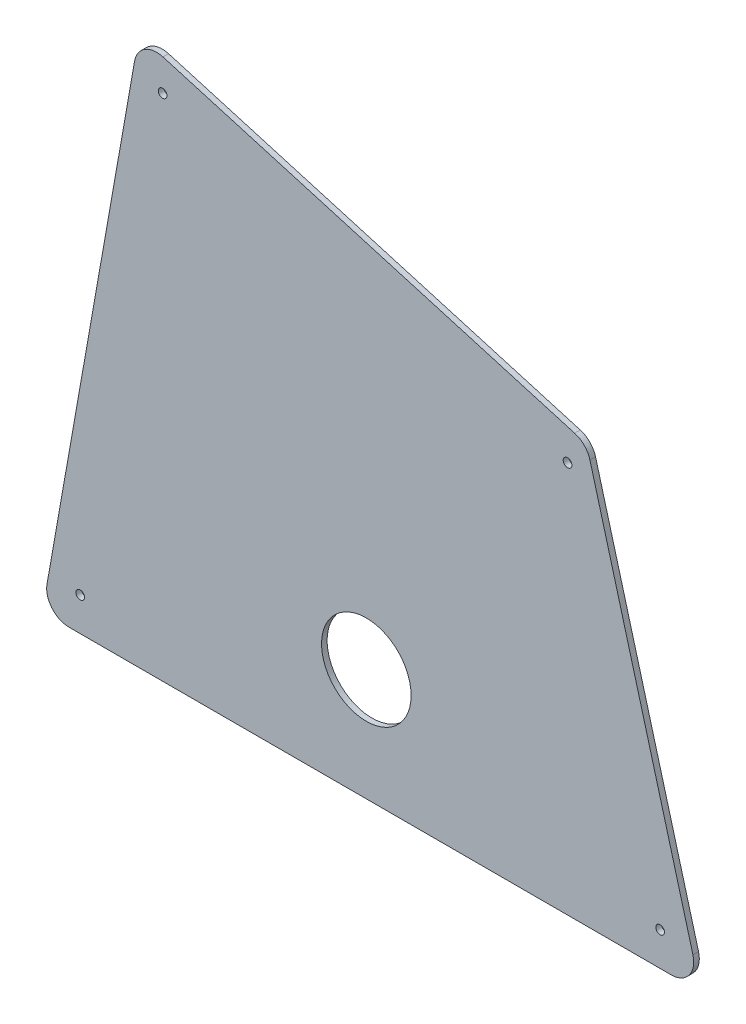
ISO-10303-21;
HEADER;
FILE_DESCRIPTION(('STEP AP214'),'2;1');
FILE_NAME('part.step','',(''),(''),'','','');
FILE_SCHEMA(('AUTOMOTIVE_DESIGN { 1 0 10303 214 1 1 1 1 }'));
ENDSEC;
DATA;
#1=APPLICATION_CONTEXT('core data for automotive mechanical design processes');
#2=APPLICATION_PROTOCOL_DEFINITION('international standard','automotive_design',2000,#1);
#3=PRODUCT_CONTEXT('',#1,'mechanical');
#4=PRODUCT('Part','Part','',(#3));
#5=PRODUCT_RELATED_PRODUCT_CATEGORY('part','',(#4));
#6=PRODUCT_DEFINITION_FORMATION('','',#4);
#7=PRODUCT_DEFINITION_CONTEXT('part definition',#1,'design');
#8=PRODUCT_DEFINITION('design','',#6,#7);
#9=PRODUCT_DEFINITION_SHAPE('','',#8);
#10=(LENGTH_UNIT() NAMED_UNIT(*) SI_UNIT(.MILLI.,.METRE.));
#11=(NAMED_UNIT(*) PLANE_ANGLE_UNIT() SI_UNIT($,.RADIAN.));
#12=(NAMED_UNIT(*) SI_UNIT($,.STERADIAN.) SOLID_ANGLE_UNIT());
#13=UNCERTAINTY_MEASURE_WITH_UNIT(LENGTH_MEASURE(1.E-05),#10,'distance_accuracy_value','');
#14=(GEOMETRIC_REPRESENTATION_CONTEXT(3) GLOBAL_UNCERTAINTY_ASSIGNED_CONTEXT((#13)) GLOBAL_UNIT_ASSIGNED_CONTEXT((#10,
#11,#12)) REPRESENTATION_CONTEXT('',''));
#15=CARTESIAN_POINT('',(0.,0.,0.));
#16=DIRECTION('',(0.,0.,1.));
#17=DIRECTION('',(1.,0.,0.));
#18=AXIS2_PLACEMENT_3D('',#15,#16,#17);
#19=CARTESIAN_POINT('',(-168.674542419112,-172.318008497211,3.175));
#20=DIRECTION('',(0.,0.,-1.));
#21=DIRECTION('',(-1.,0.,0.));
#22=AXIS2_PLACEMENT_3D('',#19,#20,#21);
#23=PLANE('',#22);
#24=CARTESIAN_POINT('',(-115.585524201329,103.906991502789,3.175));
#25=DIRECTION('',(0.,0.,1.));
#26=DIRECTION('',(1.,0.,0.));
#27=AXIS2_PLACEMENT_3D('',#24,#25,#26);
#28=CIRCLE('',#27,2.45744999999999);
#29=CARTESIAN_POINT('',(-113.128074201329,103.906991502789,3.175));
#30=VERTEX_POINT('',#29);
#31=EDGE_CURVE('E206',#30,#30,#28,.T.);
#32=ORIENTED_EDGE('',*,*,#31,.F.);
#33=EDGE_LOOP('',(#32));
#34=FACE_BOUND('',#33,.T.);
#35=CARTESIAN_POINT('',(114.17272654423,37.2319915027894,3.175));
#36=DIRECTION('',(0.,0.,1.));
#37=DIRECTION('',(1.,0.,0.));
#38=AXIS2_PLACEMENT_3D('',#35,#36,#37);
#39=CIRCLE('',#38,2.45744999999999);
#40=CARTESIAN_POINT('',(116.63017654423,37.2319915027894,3.175));
#41=VERTEX_POINT('',#40);
#42=EDGE_CURVE('E200',#41,#41,#39,.T.);
#43=ORIENTED_EDGE('',*,*,#42,.F.);
#44=EDGE_LOOP('',(#43));
#45=FACE_BOUND('',#44,.T.);
#46=CARTESIAN_POINT('',(166.708204177403,-165.968008497211,3.175));
#47=DIRECTION('',(0.,0.,1.));
#48=DIRECTION('',(1.,0.,0.));
#49=AXIS2_PLACEMENT_3D('',#46,#47,#48);
#50=CIRCLE('',#49,2.45745);
#51=CARTESIAN_POINT('',(169.165654177403,-165.968008497211,3.175));
#52=VERTEX_POINT('',#51);
#53=EDGE_CURVE('E194',#52,#52,#50,.T.);
#54=ORIENTED_EDGE('',*,*,#53,.F.);
#55=EDGE_LOOP('',(#54));
#56=FACE_BOUND('',#55,.T.);
#57=CARTESIAN_POINT('',(-162.324542419112,-165.968008497211,3.175));
#58=DIRECTION('',(0.,0.,1.));
#59=DIRECTION('',(1.,0.,0.));
#60=AXIS2_PLACEMENT_3D('',#57,#58,#59);
#61=CIRCLE('',#60,2.45745);
#62=CARTESIAN_POINT('',(-159.867092419112,-165.968008497211,3.175));
#63=VERTEX_POINT('',#62);
#64=EDGE_CURVE('E188',#63,#63,#61,.T.);
#65=ORIENTED_EDGE('',*,*,#64,.F.);
#66=EDGE_LOOP('',(#65));
#67=FACE_BOUND('',#66,.T.);
#68=CARTESIAN_POINT('',(-168.674542419112,-172.318008497211,3.175));
#69=DIRECTION('',(0.,0.,1.));
#70=DIRECTION('',(-1.,0.,0.));
#71=AXIS2_PLACEMENT_3D('',#68,#69,#70);
#72=CIRCLE('',#71,12.7);
#73=CARTESIAN_POINT('',(-181.181600882367,-170.112676640841,3.175));
#74=VERTEX_POINT('',#73);
#75=CARTESIAN_POINT('',(-168.674542419112,-185.018008497211,3.175));
#76=VERTEX_POINT('',#75);
#77=EDGE_CURVE('E146',#74,#76,#72,.T.);
#78=ORIENTED_EDGE('',*,*,#77,.T.);
#79=DIRECTION('',(1.,0.,0.));
#80=VECTOR('',#79,1.);
#81=CARTESIAN_POINT('',(-168.674542419112,-185.018008497211,3.175));
#82=LINE('',#81,#80);
#83=CARTESIAN_POINT('',(173.058204177403,-185.018008497211,3.175));
#84=VERTEX_POINT('',#83);
#85=EDGE_CURVE('E94',#76,#84,#82,.T.);
#86=ORIENTED_EDGE('',*,*,#85,.T.);
#87=CARTESIAN_POINT('',(173.058204177403,-172.318008497211,3.175));
#88=DIRECTION('',(0.,0.,1.));
#89=DIRECTION('',(1.,0.,0.));
#90=AXIS2_PLACEMENT_3D('',#87,#88,#89);
#91=CIRCLE('',#90,12.7);
#92=CARTESIAN_POINT('',(185.309252430684,-168.971096981235,3.175));
#93=VERTEX_POINT('',#92);
#94=EDGE_CURVE('E161',#84,#93,#91,.T.);
#95=ORIENTED_EDGE('',*,*,#94,.T.);
#96=DIRECTION('',(-0.263536339840617,0.964649468762312,0.));
#97=VECTOR('',#96,1.);
#98=CARTESIAN_POINT('',(185.309252430684,-168.971096981235,3.175));
#99=LINE('',#98,#97);
#100=CARTESIAN_POINT('',(126.87272654423,44.930195291305,3.175));
#101=VERTEX_POINT('',#100);
#102=EDGE_CURVE('E174',#93,#101,#99,.T.);
#103=ORIENTED_EDGE('',*,*,#102,.T.);
#104=CARTESIAN_POINT('',(114.621678290948,41.5832837753292,3.175));
#105=DIRECTION('',(0.,0.,1.));
#106=DIRECTION('',(-1.,0.,0.));
#107=AXIS2_PLACEMENT_3D('',#104,#105,#106);
#108=CIRCLE('',#107,12.7);
#109=CARTESIAN_POINT('',(118.175506769142,53.7759169260305,3.175));
#110=VERTEX_POINT('',#109);
#111=EDGE_CURVE('E113',#101,#110,#108,.T.);
#112=ORIENTED_EDGE('',*,*,#111,.T.);
#113=DIRECTION('',(-0.960049854385928,0.279829014030992,0.));
#114=VECTOR('',#113,1.);
#115=CARTESIAN_POINT('',(-115.399637259881,121.856862886483,3.175));
#116=LINE('',#115,#114);
#117=CARTESIAN_POINT('',(-115.399637259881,121.856862886483,3.175));
#118=VERTEX_POINT('',#117);
#119=EDGE_CURVE('E107',#110,#118,#116,.T.);
#120=ORIENTED_EDGE('',*,*,#119,.T.);
#121=CARTESIAN_POINT('',(-118.953465738074,109.664229735781,3.175));
#122=DIRECTION('',(0.,0.,1.));
#123=DIRECTION('',(-1.,0.,0.));
#124=AXIS2_PLACEMENT_3D('',#121,#122,#123);
#125=CIRCLE('',#124,12.7);
#126=CARTESIAN_POINT('',(-131.460524201329,111.869561592151,3.175));
#127=VERTEX_POINT('',#126);
#128=EDGE_CURVE('E111',#118,#127,#125,.T.);
#129=ORIENTED_EDGE('',*,*,#128,.T.);
#130=DIRECTION('',(-0.173648177666927,-0.984807753012209,0.));
#131=VECTOR('',#130,1.);
#132=CARTESIAN_POINT('',(-181.181600882367,-170.112676640841,3.175));
#133=LINE('',#132,#131);
#134=EDGE_CURVE('E51',#127,#74,#133,.T.);
#135=ORIENTED_EDGE('',*,*,#134,.T.);
#136=EDGE_LOOP('',(#78,#86,#95,#103,#112,#120,#129,#135));
#137=FACE_BOUND('',#136,.T.);
#138=CARTESIAN_POINT('',(0.,-121.518008497211,3.175));
#139=DIRECTION('',(0.,0.,1.));
#140=DIRECTION('',(1.,0.,0.));
#141=AXIS2_PLACEMENT_3D('',#138,#139,#140);
#142=CIRCLE('',#141,25.4);
#143=CARTESIAN_POINT('',(25.4,-121.518008497211,3.175));
#144=VERTEX_POINT('',#143);
#145=EDGE_CURVE('E135',#144,#144,#142,.T.);
#146=ORIENTED_EDGE('',*,*,#145,.F.);
#147=EDGE_LOOP('',(#146));
#148=FACE_BOUND('',#147,.T.);
#149=ADVANCED_FACE('F34',(#34,#45,#56,#67,#137,#148),#23,.F.);
#150=CARTESIAN_POINT('',(-168.674542419112,-172.318008497211,0.));
#151=DIRECTION('',(0.,0.,-1.));
#152=DIRECTION('',(-1.,0.,0.));
#153=AXIS2_PLACEMENT_3D('',#150,#151,#152);
#154=PLANE('',#153);
#155=CARTESIAN_POINT('',(-115.585524201329,103.906991502789,0.));
#156=DIRECTION('',(0.,0.,1.));
#157=DIRECTION('',(1.,0.,0.));
#158=AXIS2_PLACEMENT_3D('',#155,#156,#157);
#159=CIRCLE('',#158,2.45745);
#160=CARTESIAN_POINT('',(-113.128074201329,103.906991502789,0.));
#161=VERTEX_POINT('',#160);
#162=EDGE_CURVE('E203',#161,#161,#159,.T.);
#163=ORIENTED_EDGE('',*,*,#162,.T.);
#164=EDGE_LOOP('',(#163));
#165=FACE_BOUND('',#164,.T.);
#166=CARTESIAN_POINT('',(114.17272654423,37.2319915027894,0.));
#167=DIRECTION('',(0.,0.,1.));
#168=DIRECTION('',(1.,0.,0.));
#169=AXIS2_PLACEMENT_3D('',#166,#167,#168);
#170=CIRCLE('',#169,2.45745);
#171=CARTESIAN_POINT('',(116.63017654423,37.2319915027894,0.));
#172=VERTEX_POINT('',#171);
#173=EDGE_CURVE('E197',#172,#172,#170,.T.);
#174=ORIENTED_EDGE('',*,*,#173,.T.);
#175=EDGE_LOOP('',(#174));
#176=FACE_BOUND('',#175,.T.);
#177=CARTESIAN_POINT('',(166.708204177403,-165.968008497211,0.));
#178=DIRECTION('',(0.,0.,1.));
#179=DIRECTION('',(1.,0.,0.));
#180=AXIS2_PLACEMENT_3D('',#177,#178,#179);
#181=CIRCLE('',#180,2.45745);
#182=CARTESIAN_POINT('',(169.165654177403,-165.968008497211,0.));
#183=VERTEX_POINT('',#182);
#184=EDGE_CURVE('E191',#183,#183,#181,.T.);
#185=ORIENTED_EDGE('',*,*,#184,.T.);
#186=EDGE_LOOP('',(#185));
#187=FACE_BOUND('',#186,.T.);
#188=CARTESIAN_POINT('',(-162.324542419112,-165.968008497211,0.));
#189=DIRECTION('',(0.,0.,1.));
#190=DIRECTION('',(1.,0.,0.));
#191=AXIS2_PLACEMENT_3D('',#188,#189,#190);
#192=CIRCLE('',#191,2.45745);
#193=CARTESIAN_POINT('',(-159.867092419112,-165.968008497211,0.));
#194=VERTEX_POINT('',#193);
#195=EDGE_CURVE('E183',#194,#194,#192,.T.);
#196=ORIENTED_EDGE('',*,*,#195,.T.);
#197=EDGE_LOOP('',(#196));
#198=FACE_BOUND('',#197,.T.);
#199=CARTESIAN_POINT('',(-168.674542419112,-172.318008497211,0.));
#200=DIRECTION('',(0.,0.,1.));
#201=DIRECTION('',(-1.,0.,0.));
#202=AXIS2_PLACEMENT_3D('',#199,#200,#201);
#203=CIRCLE('',#202,12.7);
#204=CARTESIAN_POINT('',(-181.181600882367,-170.112676640841,0.));
#205=VERTEX_POINT('',#204);
#206=CARTESIAN_POINT('',(-168.674542419112,-185.018008497211,0.));
#207=VERTEX_POINT('',#206);
#208=EDGE_CURVE('E131',#205,#207,#203,.T.);
#209=ORIENTED_EDGE('',*,*,#208,.F.);
#210=DIRECTION('',(-0.173648177666927,-0.984807753012209,0.));
#211=VECTOR('',#210,1.);
#212=CARTESIAN_POINT('',(-181.181600882367,-170.112676640841,0.));
#213=LINE('',#212,#211);
#214=CARTESIAN_POINT('',(-131.460524201329,111.869561592151,0.));
#215=VERTEX_POINT('',#214);
#216=EDGE_CURVE('E86',#215,#205,#213,.T.);
#217=ORIENTED_EDGE('',*,*,#216,.F.);
#218=CARTESIAN_POINT('',(-118.953465738074,109.664229735781,0.));
#219=DIRECTION('',(0.,0.,1.));
#220=DIRECTION('',(-1.,0.,0.));
#221=AXIS2_PLACEMENT_3D('',#218,#219,#220);
#222=CIRCLE('',#221,12.7);
#223=CARTESIAN_POINT('',(-115.399637259881,121.856862886483,0.));
#224=VERTEX_POINT('',#223);
#225=EDGE_CURVE('E80',#224,#215,#222,.T.);
#226=ORIENTED_EDGE('',*,*,#225,.F.);
#227=DIRECTION('',(-0.960049854385928,0.279829014030992,0.));
#228=VECTOR('',#227,1.);
#229=CARTESIAN_POINT('',(-115.399637259881,121.856862886483,0.));
#230=LINE('',#229,#228);
#231=CARTESIAN_POINT('',(118.175506769142,53.7759169260305,0.));
#232=VERTEX_POINT('',#231);
#233=EDGE_CURVE('E121',#232,#224,#230,.T.);
#234=ORIENTED_EDGE('',*,*,#233,.F.);
#235=CARTESIAN_POINT('',(114.621678290948,41.5832837753292,0.));
#236=DIRECTION('',(0.,0.,1.));
#237=DIRECTION('',(-1.,0.,0.));
#238=AXIS2_PLACEMENT_3D('',#235,#236,#237);
#239=CIRCLE('',#238,12.7);
#240=CARTESIAN_POINT('',(126.87272654423,44.930195291305,0.));
#241=VERTEX_POINT('',#240);
#242=EDGE_CURVE('E141',#241,#232,#239,.T.);
#243=ORIENTED_EDGE('',*,*,#242,.F.);
#244=DIRECTION('',(-0.263536339840617,0.964649468762312,0.));
#245=VECTOR('',#244,1.);
#246=CARTESIAN_POINT('',(185.309252430684,-168.971096981235,0.));
#247=LINE('',#246,#245);
#248=CARTESIAN_POINT('',(185.309252430684,-168.971096981235,0.));
#249=VERTEX_POINT('',#248);
#250=EDGE_CURVE('E139',#249,#241,#247,.T.);
#251=ORIENTED_EDGE('',*,*,#250,.F.);
#252=CARTESIAN_POINT('',(173.058204177403,-172.318008497211,0.));
#253=DIRECTION('',(0.,0.,1.));
#254=DIRECTION('',(1.,0.,0.));
#255=AXIS2_PLACEMENT_3D('',#252,#253,#254);
#256=CIRCLE('',#255,12.7);
#257=CARTESIAN_POINT('',(173.058204177403,-185.018008497211,0.));
#258=VERTEX_POINT('',#257);
#259=EDGE_CURVE('E137',#258,#249,#256,.T.);
#260=ORIENTED_EDGE('',*,*,#259,.F.);
#261=DIRECTION('',(1.,0.,0.));
#262=VECTOR('',#261,1.);
#263=CARTESIAN_POINT('',(-168.674542419112,-185.018008497211,0.));
#264=LINE('',#263,#262);
#265=EDGE_CURVE('E134',#207,#258,#264,.T.);
#266=ORIENTED_EDGE('',*,*,#265,.F.);
#267=EDGE_LOOP('',(#209,#217,#226,#234,#243,#251,#260,#266));
#268=FACE_BOUND('',#267,.T.);
#269=CARTESIAN_POINT('',(0.,-121.518008497211,0.));
#270=DIRECTION('',(0.,0.,1.));
#271=DIRECTION('',(1.,0.,0.));
#272=AXIS2_PLACEMENT_3D('',#269,#270,#271);
#273=CIRCLE('',#272,25.4);
#274=CARTESIAN_POINT('',(25.4,-121.518008497211,0.));
#275=VERTEX_POINT('',#274);
#276=EDGE_CURVE('E180',#275,#275,#273,.T.);
#277=ORIENTED_EDGE('',*,*,#276,.T.);
#278=EDGE_LOOP('',(#277));
#279=FACE_BOUND('',#278,.T.);
#280=ADVANCED_FACE('F165',(#165,#176,#187,#198,#268,#279),#154,.T.);
#281=CARTESIAN_POINT('',(-168.674542419112,-172.318008497211,3.175));
#282=DIRECTION('',(0.,0.,-1.));
#283=DIRECTION('',(-1.,0.,0.));
#284=AXIS2_PLACEMENT_3D('',#281,#282,#283);
#285=CYLINDRICAL_SURFACE('',#284,12.7);
#286=ORIENTED_EDGE('',*,*,#208,.T.);
#287=DIRECTION('',(0.,0.,-1.));
#288=VECTOR('',#287,1.);
#289=CARTESIAN_POINT('',(-168.674542419112,-185.018008497211,3.175));
#290=LINE('',#289,#288);
#291=EDGE_CURVE('E11',#76,#207,#290,.T.);
#292=ORIENTED_EDGE('',*,*,#291,.F.);
#293=ORIENTED_EDGE('',*,*,#77,.F.);
#294=DIRECTION('',(0.,0.,-1.));
#295=VECTOR('',#294,1.);
#296=CARTESIAN_POINT('',(-181.181600882367,-170.112676640841,3.175));
#297=LINE('',#296,#295);
#298=EDGE_CURVE('E127',#74,#205,#297,.T.);
#299=ORIENTED_EDGE('',*,*,#298,.T.);
#300=EDGE_LOOP('',(#286,#292,#293,#299));
#301=FACE_BOUND('',#300,.T.);
#302=ADVANCED_FACE('F36',(#301),#285,.T.);
#303=CARTESIAN_POINT('',(-168.674542419112,-185.018008497211,3.175));
#304=DIRECTION('',(0.,1.,0.));
#305=DIRECTION('',(0.,0.,1.));
#306=AXIS2_PLACEMENT_3D('',#303,#304,#305);
#307=PLANE('',#306);
#308=ORIENTED_EDGE('',*,*,#265,.T.);
#309=DIRECTION('',(0.,0.,-1.));
#310=VECTOR('',#309,1.);
#311=CARTESIAN_POINT('',(173.058204177403,-185.018008497211,3.175));
#312=LINE('',#311,#310);
#313=EDGE_CURVE('E43',#84,#258,#312,.T.);
#314=ORIENTED_EDGE('',*,*,#313,.F.);
#315=ORIENTED_EDGE('',*,*,#85,.F.);
#316=ORIENTED_EDGE('',*,*,#291,.T.);
#317=EDGE_LOOP('',(#308,#314,#315,#316));
#318=FACE_BOUND('',#317,.T.);
#319=ADVANCED_FACE('F254',(#318),#307,.F.);
#320=CARTESIAN_POINT('',(173.058204177403,-172.318008497211,3.175));
#321=DIRECTION('',(0.,0.,-1.));
#322=DIRECTION('',(-1.,0.,0.));
#323=AXIS2_PLACEMENT_3D('',#320,#321,#322);
#324=CYLINDRICAL_SURFACE('',#323,12.7);
#325=ORIENTED_EDGE('',*,*,#259,.T.);
#326=DIRECTION('',(0.,0.,-1.));
#327=VECTOR('',#326,1.);
#328=CARTESIAN_POINT('',(185.309252430684,-168.971096981235,3.175));
#329=LINE('',#328,#327);
#330=EDGE_CURVE('E153',#93,#249,#329,.T.);
#331=ORIENTED_EDGE('',*,*,#330,.F.);
#332=ORIENTED_EDGE('',*,*,#94,.F.);
#333=ORIENTED_EDGE('',*,*,#313,.T.);
#334=EDGE_LOOP('',(#325,#331,#332,#333));
#335=FACE_BOUND('',#334,.T.);
#336=ADVANCED_FACE('F159',(#335),#324,.T.);
#337=CARTESIAN_POINT('',(185.309252430684,-168.971096981235,3.175));
#338=DIRECTION('',(-0.964649468762312,-0.263536339840617,0.));
#339=DIRECTION('',(0.263536339840617,-0.964649468762312,0.));
#340=AXIS2_PLACEMENT_3D('',#337,#338,#339);
#341=PLANE('',#340);
#342=ORIENTED_EDGE('',*,*,#250,.T.);
#343=DIRECTION('',(0.,0.,-1.));
#344=VECTOR('',#343,1.);
#345=CARTESIAN_POINT('',(126.87272654423,44.930195291305,3.175));
#346=LINE('',#345,#344);
#347=EDGE_CURVE('E150',#101,#241,#346,.T.);
#348=ORIENTED_EDGE('',*,*,#347,.F.);
#349=ORIENTED_EDGE('',*,*,#102,.F.);
#350=ORIENTED_EDGE('',*,*,#330,.T.);
#351=EDGE_LOOP('',(#342,#348,#349,#350));
#352=FACE_BOUND('',#351,.T.);
#353=ADVANCED_FACE('F170',(#352),#341,.F.);
#354=CARTESIAN_POINT('',(114.621678290948,41.5832837753292,3.175));
#355=DIRECTION('',(0.,0.,-1.));
#356=DIRECTION('',(-1.,0.,0.));
#357=AXIS2_PLACEMENT_3D('',#354,#355,#356);
#358=CYLINDRICAL_SURFACE('',#357,12.7);
#359=ORIENTED_EDGE('',*,*,#242,.T.);
#360=DIRECTION('',(0.,0.,-1.));
#361=VECTOR('',#360,1.);
#362=CARTESIAN_POINT('',(118.175506769142,53.7759169260305,3.175));
#363=LINE('',#362,#361);
#364=EDGE_CURVE('E122',#110,#232,#363,.T.);
#365=ORIENTED_EDGE('',*,*,#364,.F.);
#366=ORIENTED_EDGE('',*,*,#111,.F.);
#367=ORIENTED_EDGE('',*,*,#347,.T.);
#368=EDGE_LOOP('',(#359,#365,#366,#367));
#369=FACE_BOUND('',#368,.T.);
#370=ADVANCED_FACE('F173',(#369),#358,.T.);
#371=CARTESIAN_POINT('',(-115.399637259881,121.856862886483,3.175));
#372=DIRECTION('',(-0.279829014030992,-0.960049854385928,0.));
#373=DIRECTION('',(0.960049854385929,-0.279829014030993,0.));
#374=AXIS2_PLACEMENT_3D('',#371,#372,#373);
#375=PLANE('',#374);
#376=ORIENTED_EDGE('',*,*,#233,.T.);
#377=DIRECTION('',(0.,0.,-1.));
#378=VECTOR('',#377,1.);
#379=CARTESIAN_POINT('',(-115.399637259881,121.856862886483,3.175));
#380=LINE('',#379,#378);
#381=EDGE_CURVE('E118',#118,#224,#380,.T.);
#382=ORIENTED_EDGE('',*,*,#381,.F.);
#383=ORIENTED_EDGE('',*,*,#119,.F.);
#384=ORIENTED_EDGE('',*,*,#364,.T.);
#385=EDGE_LOOP('',(#376,#382,#383,#384));
#386=FACE_BOUND('',#385,.T.);
#387=ADVANCED_FACE('F119',(#386),#375,.F.);
#388=CARTESIAN_POINT('',(-118.953465738074,109.664229735781,3.175));
#389=DIRECTION('',(0.,0.,-1.));
#390=DIRECTION('',(-1.,0.,0.));
#391=AXIS2_PLACEMENT_3D('',#388,#389,#390);
#392=CYLINDRICAL_SURFACE('',#391,12.7);
#393=ORIENTED_EDGE('',*,*,#225,.T.);
#394=DIRECTION('',(0.,0.,-1.));
#395=VECTOR('',#394,1.);
#396=CARTESIAN_POINT('',(-131.460524201329,111.869561592151,3.175));
#397=LINE('',#396,#395);
#398=EDGE_CURVE('E123',#127,#215,#397,.T.);
#399=ORIENTED_EDGE('',*,*,#398,.F.);
#400=ORIENTED_EDGE('',*,*,#128,.F.);
#401=ORIENTED_EDGE('',*,*,#381,.T.);
#402=EDGE_LOOP('',(#393,#399,#400,#401));
#403=FACE_BOUND('',#402,.T.);
#404=ADVANCED_FACE('F125',(#403),#392,.T.);
#405=CARTESIAN_POINT('',(-181.181600882367,-170.112676640841,3.175));
#406=DIRECTION('',(0.984807753012209,-0.173648177666927,0.));
#407=DIRECTION('',(0.173648177666927,0.984807753012209,0.));
#408=AXIS2_PLACEMENT_3D('',#405,#406,#407);
#409=PLANE('',#408);
#410=ORIENTED_EDGE('',*,*,#216,.T.);
#411=ORIENTED_EDGE('',*,*,#298,.F.);
#412=ORIENTED_EDGE('',*,*,#134,.F.);
#413=ORIENTED_EDGE('',*,*,#398,.T.);
#414=EDGE_LOOP('',(#410,#411,#412,#413));
#415=FACE_BOUND('',#414,.T.);
#416=ADVANCED_FACE('F234',(#415),#409,.F.);
#417=CARTESIAN_POINT('',(0.,-121.518008497211,3.175));
#418=DIRECTION('',(0.,0.,-1.));
#419=DIRECTION('',(-1.,0.,0.));
#420=AXIS2_PLACEMENT_3D('',#417,#418,#419);
#421=CYLINDRICAL_SURFACE('',#420,25.4);
#422=ORIENTED_EDGE('',*,*,#145,.T.);
#423=EDGE_LOOP('',(#422));
#424=FACE_BOUND('',#423,.T.);
#425=ORIENTED_EDGE('',*,*,#276,.F.);
#426=EDGE_LOOP('',(#425));
#427=FACE_BOUND('',#426,.T.);
#428=ADVANCED_FACE('F224',(#424,#427),#421,.F.);
#429=CARTESIAN_POINT('',(-162.324542419112,-165.968008497211,3.175));
#430=DIRECTION('',(0.,0.,1.));
#431=DIRECTION('',(1.,0.,0.));
#432=AXIS2_PLACEMENT_3D('',#429,#430,#431);
#433=CYLINDRICAL_SURFACE('',#432,2.45745);
#434=ORIENTED_EDGE('',*,*,#195,.F.);
#435=EDGE_LOOP('',(#434));
#436=FACE_BOUND('',#435,.T.);
#437=ORIENTED_EDGE('',*,*,#64,.T.);
#438=EDGE_LOOP('',(#437));
#439=FACE_BOUND('',#438,.T.);
#440=ADVANCED_FACE('F221',(#436,#439),#433,.F.);
#441=CARTESIAN_POINT('',(166.708204177403,-165.968008497211,3.175));
#442=DIRECTION('',(0.,0.,1.));
#443=DIRECTION('',(1.,0.,0.));
#444=AXIS2_PLACEMENT_3D('',#441,#442,#443);
#445=CYLINDRICAL_SURFACE('',#444,2.45745);
#446=ORIENTED_EDGE('',*,*,#184,.F.);
#447=EDGE_LOOP('',(#446));
#448=FACE_BOUND('',#447,.T.);
#449=ORIENTED_EDGE('',*,*,#53,.T.);
#450=EDGE_LOOP('',(#449));
#451=FACE_BOUND('',#450,.T.);
#452=ADVANCED_FACE('F223',(#448,#451),#445,.F.);
#453=CARTESIAN_POINT('',(114.17272654423,37.2319915027894,3.175));
#454=DIRECTION('',(0.,0.,1.));
#455=DIRECTION('',(1.,0.,0.));
#456=AXIS2_PLACEMENT_3D('',#453,#454,#455);
#457=CYLINDRICAL_SURFACE('',#456,2.45744999999999);
#458=ORIENTED_EDGE('',*,*,#173,.F.);
#459=EDGE_LOOP('',(#458));
#460=FACE_BOUND('',#459,.T.);
#461=ORIENTED_EDGE('',*,*,#42,.T.);
#462=EDGE_LOOP('',(#461));
#463=FACE_BOUND('',#462,.T.);
#464=ADVANCED_FACE('F231',(#460,#463),#457,.F.);
#465=CARTESIAN_POINT('',(-115.585524201329,103.906991502789,3.175));
#466=DIRECTION('',(0.,0.,1.));
#467=DIRECTION('',(1.,0.,0.));
#468=AXIS2_PLACEMENT_3D('',#465,#466,#467);
#469=CYLINDRICAL_SURFACE('',#468,2.45744999999999);
#470=ORIENTED_EDGE('',*,*,#162,.F.);
#471=EDGE_LOOP('',(#470));
#472=FACE_BOUND('',#471,.T.);
#473=ORIENTED_EDGE('',*,*,#31,.T.);
#474=EDGE_LOOP('',(#473));
#475=FACE_BOUND('',#474,.T.);
#476=ADVANCED_FACE('F210',(#472,#475),#469,.F.);
#477=CLOSED_SHELL('',(#149,#280,#302,#319,#336,#353,#370,#387,#404,#416,#428,#440,#452,#464,#476));
#478=MANIFOLD_SOLID_BREP('B2',#477);
#479=ADVANCED_BREP_SHAPE_REPRESENTATION('',(#18,#478),#14);
#480=SHAPE_DEFINITION_REPRESENTATION(#9,#479);
ENDSEC;
END-ISO-10303-21;
